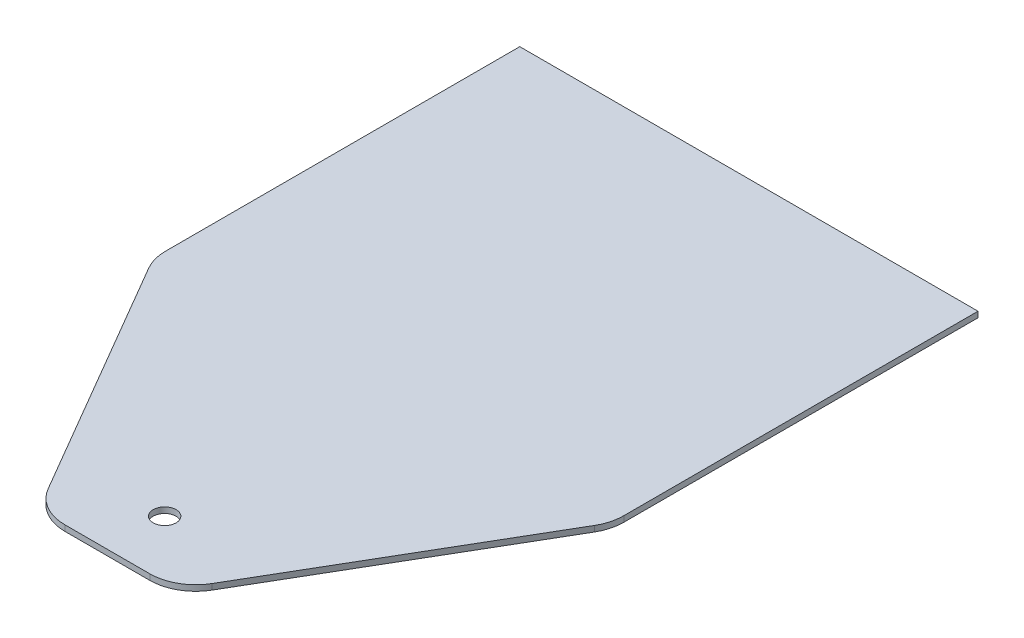
ISO-10303-21;
HEADER;
FILE_DESCRIPTION(('STEP AP214'),'2;1');
FILE_NAME('part.step','',(''),(''),'','','');
FILE_SCHEMA(('AUTOMOTIVE_DESIGN { 1 0 10303 214 1 1 1 1 }'));
ENDSEC;
DATA;
#1=APPLICATION_CONTEXT('core data for automotive mechanical design processes');
#2=APPLICATION_PROTOCOL_DEFINITION('international standard','automotive_design',2000,#1);
#3=PRODUCT_CONTEXT('',#1,'mechanical');
#4=PRODUCT('Part','Part','',(#3));
#5=PRODUCT_RELATED_PRODUCT_CATEGORY('part','',(#4));
#6=PRODUCT_DEFINITION_FORMATION('','',#4);
#7=PRODUCT_DEFINITION_CONTEXT('part definition',#1,'design');
#8=PRODUCT_DEFINITION('design','',#6,#7);
#9=PRODUCT_DEFINITION_SHAPE('','',#8);
#10=(LENGTH_UNIT() NAMED_UNIT(*) SI_UNIT(.MILLI.,.METRE.));
#11=(NAMED_UNIT(*) PLANE_ANGLE_UNIT() SI_UNIT($,.RADIAN.));
#12=(NAMED_UNIT(*) SI_UNIT($,.STERADIAN.) SOLID_ANGLE_UNIT());
#13=UNCERTAINTY_MEASURE_WITH_UNIT(LENGTH_MEASURE(1.E-05),#10,'distance_accuracy_value','');
#14=(GEOMETRIC_REPRESENTATION_CONTEXT(3) GLOBAL_UNCERTAINTY_ASSIGNED_CONTEXT((#13)) GLOBAL_UNIT_ASSIGNED_CONTEXT((#10,
#11,#12)) REPRESENTATION_CONTEXT('',''));
#15=CARTESIAN_POINT('',(0.,0.,0.));
#16=DIRECTION('',(0.,0.,1.));
#17=DIRECTION('',(1.,0.,0.));
#18=AXIS2_PLACEMENT_3D('',#15,#16,#17);
#19=CARTESIAN_POINT('',(19.05,0.79375,177.8));
#20=DIRECTION('',(-0.863778900898434,0.,-0.503871025524086));
#21=DIRECTION('',(-0.503871025524086,0.,0.863778900898434));
#22=AXIS2_PLACEMENT_3D('',#19,#20,#21);
#23=PLANE('',#22);
#24=DIRECTION('',(0.503871025524086,0.,-0.863778900898434));
#25=VECTOR('',#24,1.);
#26=CARTESIAN_POINT('',(19.05,-0.79375,177.8));
#27=LINE('',#26,#25);
#28=CARTESIAN_POINT('',(22.7254888192424,-0.79375,171.499162024156));
#29=VERTEX_POINT('',#28);
#30=CARTESIAN_POINT('',(61.7699920414101,-0.79375,104.565727929011));
#31=VERTEX_POINT('',#30);
#32=EDGE_CURVE('E146',#29,#31,#27,.T.);
#33=ORIENTED_EDGE('',*,*,#32,.T.);
#34=DIRECTION('',(0.,-1.,0.));
#35=VECTOR('',#34,1.);
#36=CARTESIAN_POINT('',(61.7699920414101,0.79375,104.565727929011));
#37=LINE('',#36,#35);
#38=CARTESIAN_POINT('',(61.7699920414101,0.79375,104.565727929011));
#39=VERTEX_POINT('',#38);
#40=EDGE_CURVE('E174',#31,#39,#37,.F.);
#41=ORIENTED_EDGE('',*,*,#40,.T.);
#42=DIRECTION('',(0.503871025524086,0.,-0.863778900898434));
#43=VECTOR('',#42,1.);
#44=CARTESIAN_POINT('',(19.05,0.79375,177.8));
#45=LINE('',#44,#43);
#46=CARTESIAN_POINT('',(22.7254888192424,0.79375,171.499162024156));
#47=VERTEX_POINT('',#46);
#48=EDGE_CURVE('E122',#47,#39,#45,.T.);
#49=ORIENTED_EDGE('',*,*,#48,.F.);
#50=DIRECTION('',(0.,-1.,0.));
#51=VECTOR('',#50,1.);
#52=CARTESIAN_POINT('',(22.7254888192424,0.79375,171.499162024156));
#53=LINE('',#52,#51);
#54=EDGE_CURVE('E171',#47,#29,#53,.T.);
#55=ORIENTED_EDGE('',*,*,#54,.T.);
#56=EDGE_LOOP('',(#33,#41,#49,#55));
#57=FACE_BOUND('',#56,.T.);
#58=ADVANCED_FACE('F33',(#57),#23,.F.);
#59=CARTESIAN_POINT('',(63.5,0.79375,101.6));
#60=DIRECTION('',(-1.,0.,0.));
#61=DIRECTION('',(0.,0.,1.));
#62=AXIS2_PLACEMENT_3D('',#59,#60,#61);
#63=PLANE('',#62);
#64=DIRECTION('',(0.,0.,-1.));
#65=VECTOR('',#64,1.);
#66=CARTESIAN_POINT('',(63.5,0.79375,101.6));
#67=LINE('',#66,#65);
#68=CARTESIAN_POINT('',(63.5,0.79375,98.1665659048554));
#69=VERTEX_POINT('',#68);
#70=CARTESIAN_POINT('',(63.5,0.79375,0.));
#71=VERTEX_POINT('',#70);
#72=EDGE_CURVE('E109',#69,#71,#67,.T.);
#73=ORIENTED_EDGE('',*,*,#72,.F.);
#74=DIRECTION('',(0.,-1.,0.));
#75=VECTOR('',#74,1.);
#76=CARTESIAN_POINT('',(63.5,0.79375,98.1665659048554));
#77=LINE('',#76,#75);
#78=CARTESIAN_POINT('',(63.5,-0.79375,98.1665659048554));
#79=VERTEX_POINT('',#78);
#80=EDGE_CURVE('E131',#69,#79,#77,.T.);
#81=ORIENTED_EDGE('',*,*,#80,.T.);
#82=DIRECTION('',(0.,0.,-1.));
#83=VECTOR('',#82,1.);
#84=CARTESIAN_POINT('',(63.5,-0.79375,101.6));
#85=LINE('',#84,#83);
#86=CARTESIAN_POINT('',(63.5,-0.79375,0.));
#87=VERTEX_POINT('',#86);
#88=EDGE_CURVE('E128',#79,#87,#85,.T.);
#89=ORIENTED_EDGE('',*,*,#88,.T.);
#90=DIRECTION('',(0.,-1.,0.));
#91=VECTOR('',#90,1.);
#92=CARTESIAN_POINT('',(63.5,0.79375,0.));
#93=LINE('',#92,#91);
#94=EDGE_CURVE('E125',#71,#87,#93,.T.);
#95=ORIENTED_EDGE('',*,*,#94,.F.);
#96=EDGE_LOOP('',(#73,#81,#89,#95));
#97=FACE_BOUND('',#96,.T.);
#98=ADVANCED_FACE('F126',(#97),#63,.F.);
#99=CARTESIAN_POINT('',(-63.5,0.79375,0.));
#100=DIRECTION('',(0.,0.,1.));
#101=DIRECTION('',(1.,0.,0.));
#102=AXIS2_PLACEMENT_3D('',#99,#100,#101);
#103=PLANE('',#102);
#104=DIRECTION('',(-1.,0.,0.));
#105=VECTOR('',#104,1.);
#106=CARTESIAN_POINT('',(-63.5,-0.79375,0.));
#107=LINE('',#106,#105);
#108=CARTESIAN_POINT('',(-63.5,-0.79375,0.));
#109=VERTEX_POINT('',#108);
#110=EDGE_CURVE('E151',#87,#109,#107,.T.);
#111=ORIENTED_EDGE('',*,*,#110,.T.);
#112=DIRECTION('',(0.,-1.,0.));
#113=VECTOR('',#112,1.);
#114=CARTESIAN_POINT('',(-63.5,0.79375,0.));
#115=LINE('',#114,#113);
#116=CARTESIAN_POINT('',(-63.5,0.79375,0.));
#117=VERTEX_POINT('',#116);
#118=EDGE_CURVE('E132',#117,#109,#115,.T.);
#119=ORIENTED_EDGE('',*,*,#118,.F.);
#120=DIRECTION('',(-1.,0.,0.));
#121=VECTOR('',#120,1.);
#122=CARTESIAN_POINT('',(-63.5,0.79375,0.));
#123=LINE('',#122,#121);
#124=EDGE_CURVE('E115',#71,#117,#123,.T.);
#125=ORIENTED_EDGE('',*,*,#124,.F.);
#126=ORIENTED_EDGE('',*,*,#94,.T.);
#127=EDGE_LOOP('',(#111,#119,#125,#126));
#128=FACE_BOUND('',#127,.T.);
#129=ADVANCED_FACE('F134',(#128),#103,.F.);
#130=CARTESIAN_POINT('',(-63.5,0.79375,0.));
#131=DIRECTION('',(1.,0.,0.));
#132=DIRECTION('',(0.,0.,-1.));
#133=AXIS2_PLACEMENT_3D('',#130,#131,#132);
#134=PLANE('',#133);
#135=DIRECTION('',(0.,0.,1.));
#136=VECTOR('',#135,1.);
#137=CARTESIAN_POINT('',(-63.5,-0.79375,0.));
#138=LINE('',#137,#136);
#139=CARTESIAN_POINT('',(-63.5,-0.79375,98.1665659048554));
#140=VERTEX_POINT('',#139);
#141=EDGE_CURVE('E153',#109,#140,#138,.T.);
#142=ORIENTED_EDGE('',*,*,#141,.T.);
#143=DIRECTION('',(0.,-1.,0.));
#144=VECTOR('',#143,1.);
#145=CARTESIAN_POINT('',(-63.5,0.79375,98.1665659048554));
#146=LINE('',#145,#144);
#147=CARTESIAN_POINT('',(-63.5,0.79375,98.1665659048554));
#148=VERTEX_POINT('',#147);
#149=EDGE_CURVE('E187',#140,#148,#146,.F.);
#150=ORIENTED_EDGE('',*,*,#149,.T.);
#151=DIRECTION('',(0.,0.,1.));
#152=VECTOR('',#151,1.);
#153=CARTESIAN_POINT('',(-63.5,0.79375,0.));
#154=LINE('',#153,#152);
#155=EDGE_CURVE('E137',#117,#148,#154,.T.);
#156=ORIENTED_EDGE('',*,*,#155,.F.);
#157=ORIENTED_EDGE('',*,*,#118,.T.);
#158=EDGE_LOOP('',(#142,#150,#156,#157));
#159=FACE_BOUND('',#158,.T.);
#160=ADVANCED_FACE('F190',(#159),#134,.F.);
#161=CARTESIAN_POINT('',(-63.5,0.79375,101.6));
#162=DIRECTION('',(0.863778900898434,0.,-0.503871025524086));
#163=DIRECTION('',(-0.503871025524086,0.,-0.863778900898434));
#164=AXIS2_PLACEMENT_3D('',#161,#162,#163);
#165=PLANE('',#164);
#166=DIRECTION('',(0.503871025524086,0.,0.863778900898434));
#167=VECTOR('',#166,1.);
#168=CARTESIAN_POINT('',(-63.5,0.79375,101.6));
#169=LINE('',#168,#167);
#170=CARTESIAN_POINT('',(-61.7699920414101,0.79375,104.565727929011));
#171=VERTEX_POINT('',#170);
#172=CARTESIAN_POINT('',(-22.7254888192424,0.79375,171.499162024156));
#173=VERTEX_POINT('',#172);
#174=EDGE_CURVE('E139',#171,#173,#169,.T.);
#175=ORIENTED_EDGE('',*,*,#174,.F.);
#176=DIRECTION('',(0.,-1.,0.));
#177=VECTOR('',#176,1.);
#178=CARTESIAN_POINT('',(-61.7699920414101,0.79375,104.565727929011));
#179=LINE('',#178,#177);
#180=CARTESIAN_POINT('',(-61.7699920414101,-0.79375,104.565727929011));
#181=VERTEX_POINT('',#180);
#182=EDGE_CURVE('E184',#171,#181,#179,.T.);
#183=ORIENTED_EDGE('',*,*,#182,.T.);
#184=DIRECTION('',(0.503871025524086,0.,0.863778900898434));
#185=VECTOR('',#184,1.);
#186=CARTESIAN_POINT('',(-63.5,-0.79375,101.6));
#187=LINE('',#186,#185);
#188=CARTESIAN_POINT('',(-22.7254888192424,-0.79375,171.499162024156));
#189=VERTEX_POINT('',#188);
#190=EDGE_CURVE('E156',#181,#189,#187,.T.);
#191=ORIENTED_EDGE('',*,*,#190,.T.);
#192=DIRECTION('',(0.,-1.,0.));
#193=VECTOR('',#192,1.);
#194=CARTESIAN_POINT('',(-22.7254888192424,0.79375,171.499162024156));
#195=LINE('',#194,#193);
#196=EDGE_CURVE('E182',#189,#173,#195,.F.);
#197=ORIENTED_EDGE('',*,*,#196,.T.);
#198=EDGE_LOOP('',(#175,#183,#191,#197));
#199=FACE_BOUND('',#198,.T.);
#200=ADVANCED_FACE('F199',(#199),#165,.F.);
#201=CARTESIAN_POINT('',(-19.05,0.79375,177.8));
#202=DIRECTION('',(0.,0.,-1.));
#203=DIRECTION('',(-1.,0.,0.));
#204=AXIS2_PLACEMENT_3D('',#201,#202,#203);
#205=PLANE('',#204);
#206=DIRECTION('',(1.,0.,0.));
#207=VECTOR('',#206,1.);
#208=CARTESIAN_POINT('',(-19.05,0.79375,177.8));
#209=LINE('',#208,#207);
#210=CARTESIAN_POINT('',(-11.7554967778323,0.79375,177.8));
#211=VERTEX_POINT('',#210);
#212=CARTESIAN_POINT('',(11.7554967778323,0.79375,177.8));
#213=VERTEX_POINT('',#212);
#214=EDGE_CURVE('E144',#211,#213,#209,.T.);
#215=ORIENTED_EDGE('',*,*,#214,.F.);
#216=DIRECTION('',(0.,-1.,0.));
#217=VECTOR('',#216,1.);
#218=CARTESIAN_POINT('',(-11.7554967778323,0.79375,177.8));
#219=LINE('',#218,#217);
#220=CARTESIAN_POINT('',(-11.7554967778323,-0.79375,177.8));
#221=VERTEX_POINT('',#220);
#222=EDGE_CURVE('E11',#211,#221,#219,.T.);
#223=ORIENTED_EDGE('',*,*,#222,.T.);
#224=DIRECTION('',(1.,0.,0.));
#225=VECTOR('',#224,1.);
#226=CARTESIAN_POINT('',(-19.05,-0.79375,177.8));
#227=LINE('',#226,#225);
#228=CARTESIAN_POINT('',(11.7554967778323,-0.79375,177.8));
#229=VERTEX_POINT('',#228);
#230=EDGE_CURVE('E159',#221,#229,#227,.T.);
#231=ORIENTED_EDGE('',*,*,#230,.T.);
#232=DIRECTION('',(0.,-1.,0.));
#233=VECTOR('',#232,1.);
#234=CARTESIAN_POINT('',(11.7554967778323,0.79375,177.8));
#235=LINE('',#234,#233);
#236=EDGE_CURVE('E41',#229,#213,#235,.F.);
#237=ORIENTED_EDGE('',*,*,#236,.T.);
#238=EDGE_LOOP('',(#215,#223,#231,#237));
#239=FACE_BOUND('',#238,.T.);
#240=ADVANCED_FACE('F207',(#239),#205,.F.);
#241=CARTESIAN_POINT('',(0.,0.79375,0.));
#242=DIRECTION('',(0.,-1.,0.));
#243=DIRECTION('',(0.,0.,-1.));
#244=AXIS2_PLACEMENT_3D('',#241,#242,#243);
#245=PLANE('',#244);
#246=CARTESIAN_POINT('',(0.,0.79375,161.925));
#247=DIRECTION('',(0.,1.,0.));
#248=DIRECTION('',(0.,0.,1.));
#249=AXIS2_PLACEMENT_3D('',#246,#247,#248);
#250=CIRCLE('',#249,3.175);
#251=CARTESIAN_POINT('',(0.,0.79375,165.1));
#252=VERTEX_POINT('',#251);
#253=EDGE_CURVE('E149',#252,#252,#250,.T.);
#254=ORIENTED_EDGE('',*,*,#253,.F.);
#255=EDGE_LOOP('',(#254));
#256=FACE_BOUND('',#255,.T.);
#257=ORIENTED_EDGE('',*,*,#48,.T.);
#258=CARTESIAN_POINT('',(50.8,0.79375,98.1665659048554));
#259=DIRECTION('',(0.,-1.,0.));
#260=DIRECTION('',(0.,0.,-1.));
#261=AXIS2_PLACEMENT_3D('',#258,#259,#260);
#262=CIRCLE('',#261,12.7);
#263=EDGE_CURVE('E118',#39,#69,#262,.F.);
#264=ORIENTED_EDGE('',*,*,#263,.T.);
#265=ORIENTED_EDGE('',*,*,#72,.T.);
#266=ORIENTED_EDGE('',*,*,#124,.T.);
#267=ORIENTED_EDGE('',*,*,#155,.T.);
#268=CARTESIAN_POINT('',(-50.8,0.79375,98.1665659048554));
#269=DIRECTION('',(0.,-1.,0.));
#270=DIRECTION('',(0.,0.,-1.));
#271=AXIS2_PLACEMENT_3D('',#268,#269,#270);
#272=CIRCLE('',#271,12.7);
#273=EDGE_CURVE('E179',#148,#171,#272,.F.);
#274=ORIENTED_EDGE('',*,*,#273,.T.);
#275=ORIENTED_EDGE('',*,*,#174,.T.);
#276=CARTESIAN_POINT('',(-11.7554967778323,0.79375,165.1));
#277=DIRECTION('',(0.,-1.,0.));
#278=DIRECTION('',(0.,0.,-1.));
#279=AXIS2_PLACEMENT_3D('',#276,#277,#278);
#280=CIRCLE('',#279,12.7);
#281=EDGE_CURVE('E54',#173,#211,#280,.F.);
#282=ORIENTED_EDGE('',*,*,#281,.T.);
#283=ORIENTED_EDGE('',*,*,#214,.T.);
#284=CARTESIAN_POINT('',(11.7554967778323,0.79375,165.1));
#285=DIRECTION('',(0.,-1.,0.));
#286=DIRECTION('',(0.,0.,-1.));
#287=AXIS2_PLACEMENT_3D('',#284,#285,#286);
#288=CIRCLE('',#287,12.7);
#289=EDGE_CURVE('E176',#213,#47,#288,.F.);
#290=ORIENTED_EDGE('',*,*,#289,.T.);
#291=EDGE_LOOP('',(#257,#264,#265,#266,#267,#274,#275,#282,#283,#290));
#292=FACE_BOUND('',#291,.T.);
#293=ADVANCED_FACE('F112',(#256,#292),#245,.F.);
#294=CARTESIAN_POINT('',(0.,-0.79375,0.));
#295=DIRECTION('',(0.,-1.,0.));
#296=DIRECTION('',(0.,0.,-1.));
#297=AXIS2_PLACEMENT_3D('',#294,#295,#296);
#298=PLANE('',#297);
#299=CARTESIAN_POINT('',(0.,-0.79375,161.925));
#300=DIRECTION('',(0.,-1.,0.));
#301=DIRECTION('',(0.,0.,-1.));
#302=AXIS2_PLACEMENT_3D('',#299,#300,#301);
#303=CIRCLE('',#302,3.175);
#304=CARTESIAN_POINT('',(0.,-0.79375,158.75));
#305=VERTEX_POINT('',#304);
#306=EDGE_CURVE('E218',#305,#305,#303,.F.);
#307=ORIENTED_EDGE('',*,*,#306,.T.);
#308=EDGE_LOOP('',(#307));
#309=FACE_BOUND('',#308,.T.);
#310=ORIENTED_EDGE('',*,*,#88,.F.);
#311=CARTESIAN_POINT('',(50.8,-0.79375,98.1665659048554));
#312=DIRECTION('',(0.,-1.,0.));
#313=DIRECTION('',(0.,0.,-1.));
#314=AXIS2_PLACEMENT_3D('',#311,#312,#313);
#315=CIRCLE('',#314,12.7);
#316=EDGE_CURVE('E169',#79,#31,#315,.T.);
#317=ORIENTED_EDGE('',*,*,#316,.T.);
#318=ORIENTED_EDGE('',*,*,#32,.F.);
#319=CARTESIAN_POINT('',(11.7554967778323,-0.79375,165.1));
#320=DIRECTION('',(0.,-1.,0.));
#321=DIRECTION('',(0.,0.,-1.));
#322=AXIS2_PLACEMENT_3D('',#319,#320,#321);
#323=CIRCLE('',#322,12.7);
#324=EDGE_CURVE('E163',#29,#229,#323,.T.);
#325=ORIENTED_EDGE('',*,*,#324,.T.);
#326=ORIENTED_EDGE('',*,*,#230,.F.);
#327=CARTESIAN_POINT('',(-11.7554967778323,-0.79375,165.1));
#328=DIRECTION('',(0.,-1.,0.));
#329=DIRECTION('',(0.,0.,-1.));
#330=AXIS2_PLACEMENT_3D('',#327,#328,#329);
#331=CIRCLE('',#330,12.7);
#332=EDGE_CURVE('E165',#221,#189,#331,.T.);
#333=ORIENTED_EDGE('',*,*,#332,.T.);
#334=ORIENTED_EDGE('',*,*,#190,.F.);
#335=CARTESIAN_POINT('',(-50.8,-0.79375,98.1665659048554));
#336=DIRECTION('',(0.,-1.,0.));
#337=DIRECTION('',(0.,0.,-1.));
#338=AXIS2_PLACEMENT_3D('',#335,#336,#337);
#339=CIRCLE('',#338,12.7);
#340=EDGE_CURVE('E167',#181,#140,#339,.T.);
#341=ORIENTED_EDGE('',*,*,#340,.T.);
#342=ORIENTED_EDGE('',*,*,#141,.F.);
#343=ORIENTED_EDGE('',*,*,#110,.F.);
#344=EDGE_LOOP('',(#310,#317,#318,#325,#326,#333,#334,#341,#342,#343));
#345=FACE_BOUND('',#344,.T.);
#346=ADVANCED_FACE('F202',(#309,#345),#298,.T.);
#347=CARTESIAN_POINT('',(50.8,0.79375,98.1665659048554));
#348=DIRECTION('',(0.,-1.,0.));
#349=DIRECTION('',(0.,0.,-1.));
#350=AXIS2_PLACEMENT_3D('',#347,#348,#349);
#351=CYLINDRICAL_SURFACE('',#350,12.7);
#352=ORIENTED_EDGE('',*,*,#263,.F.);
#353=ORIENTED_EDGE('',*,*,#40,.F.);
#354=ORIENTED_EDGE('',*,*,#316,.F.);
#355=ORIENTED_EDGE('',*,*,#80,.F.);
#356=EDGE_LOOP('',(#352,#353,#354,#355));
#357=FACE_BOUND('',#356,.T.);
#358=ADVANCED_FACE('F216',(#357),#351,.T.);
#359=CARTESIAN_POINT('',(-50.8,0.79375,98.1665659048554));
#360=DIRECTION('',(0.,-1.,0.));
#361=DIRECTION('',(0.,0.,-1.));
#362=AXIS2_PLACEMENT_3D('',#359,#360,#361);
#363=CYLINDRICAL_SURFACE('',#362,12.7);
#364=ORIENTED_EDGE('',*,*,#273,.F.);
#365=ORIENTED_EDGE('',*,*,#149,.F.);
#366=ORIENTED_EDGE('',*,*,#340,.F.);
#367=ORIENTED_EDGE('',*,*,#182,.F.);
#368=EDGE_LOOP('',(#364,#365,#366,#367));
#369=FACE_BOUND('',#368,.T.);
#370=ADVANCED_FACE('F196',(#369),#363,.T.);
#371=CARTESIAN_POINT('',(-11.7554967778323,0.79375,165.1));
#372=DIRECTION('',(0.,-1.,0.));
#373=DIRECTION('',(0.,0.,-1.));
#374=AXIS2_PLACEMENT_3D('',#371,#372,#373);
#375=CYLINDRICAL_SURFACE('',#374,12.7);
#376=ORIENTED_EDGE('',*,*,#281,.F.);
#377=ORIENTED_EDGE('',*,*,#196,.F.);
#378=ORIENTED_EDGE('',*,*,#332,.F.);
#379=ORIENTED_EDGE('',*,*,#222,.F.);
#380=EDGE_LOOP('',(#376,#377,#378,#379));
#381=FACE_BOUND('',#380,.T.);
#382=ADVANCED_FACE('F206',(#381),#375,.T.);
#383=CARTESIAN_POINT('',(11.7554967778323,0.79375,165.1));
#384=DIRECTION('',(0.,-1.,0.));
#385=DIRECTION('',(0.,0.,-1.));
#386=AXIS2_PLACEMENT_3D('',#383,#384,#385);
#387=CYLINDRICAL_SURFACE('',#386,12.7);
#388=ORIENTED_EDGE('',*,*,#289,.F.);
#389=ORIENTED_EDGE('',*,*,#236,.F.);
#390=ORIENTED_EDGE('',*,*,#324,.F.);
#391=ORIENTED_EDGE('',*,*,#54,.F.);
#392=EDGE_LOOP('',(#388,#389,#390,#391));
#393=FACE_BOUND('',#392,.T.);
#394=ADVANCED_FACE('F35',(#393),#387,.T.);
#395=CARTESIAN_POINT('',(0.,-0.79475,161.925));
#396=DIRECTION('',(0.,1.,0.));
#397=DIRECTION('',(0.,0.,1.));
#398=AXIS2_PLACEMENT_3D('',#395,#396,#397);
#399=CYLINDRICAL_SURFACE('',#398,3.175);
#400=ORIENTED_EDGE('',*,*,#306,.F.);
#401=EDGE_LOOP('',(#400));
#402=FACE_BOUND('',#401,.T.);
#403=ORIENTED_EDGE('',*,*,#253,.T.);
#404=EDGE_LOOP('',(#403));
#405=FACE_BOUND('',#404,.T.);
#406=ADVANCED_FACE('F224',(#402,#405),#399,.F.);
#407=CLOSED_SHELL('',(#58,#98,#129,#160,#200,#240,#293,#346,#358,#370,#382,#394,#406));
#408=MANIFOLD_SOLID_BREP('B2',#407);
#409=ADVANCED_BREP_SHAPE_REPRESENTATION('',(#18,#408),#14);
#410=SHAPE_DEFINITION_REPRESENTATION(#9,#409);
ENDSEC;
END-ISO-10303-21;
